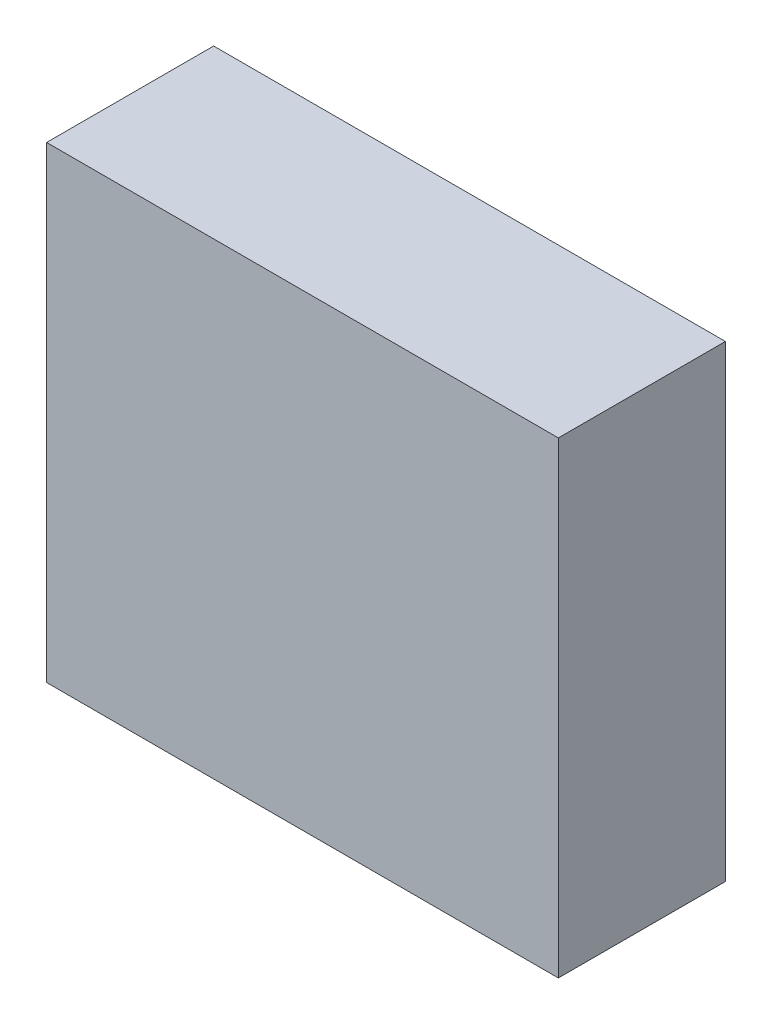
ISO-10303-21;
HEADER;
FILE_DESCRIPTION(('STEP AP214'),'2;1');
FILE_NAME('part.step','',(''),(''),'','','');
FILE_SCHEMA(('AUTOMOTIVE_DESIGN { 1 0 10303 214 1 1 1 1 }'));
ENDSEC;
DATA;
#1=APPLICATION_CONTEXT('core data for automotive mechanical design processes');
#2=APPLICATION_PROTOCOL_DEFINITION('international standard','automotive_design',2000,#1);
#3=PRODUCT_CONTEXT('',#1,'mechanical');
#4=PRODUCT('Part','Part','',(#3));
#5=PRODUCT_RELATED_PRODUCT_CATEGORY('part','',(#4));
#6=PRODUCT_DEFINITION_FORMATION('','',#4);
#7=PRODUCT_DEFINITION_CONTEXT('part definition',#1,'design');
#8=PRODUCT_DEFINITION('design','',#6,#7);
#9=PRODUCT_DEFINITION_SHAPE('','',#8);
#10=(LENGTH_UNIT() NAMED_UNIT(*) SI_UNIT(.MILLI.,.METRE.));
#11=(NAMED_UNIT(*) PLANE_ANGLE_UNIT() SI_UNIT($,.RADIAN.));
#12=(NAMED_UNIT(*) SI_UNIT($,.STERADIAN.) SOLID_ANGLE_UNIT());
#13=UNCERTAINTY_MEASURE_WITH_UNIT(LENGTH_MEASURE(1.E-05),#10,'distance_accuracy_value','');
#14=(GEOMETRIC_REPRESENTATION_CONTEXT(3) GLOBAL_UNCERTAINTY_ASSIGNED_CONTEXT((#13)) GLOBAL_UNIT_ASSIGNED_CONTEXT((#10,
#11,#12)) REPRESENTATION_CONTEXT('',''));
#15=CARTESIAN_POINT('',(0.,0.,0.));
#16=DIRECTION('',(0.,0.,1.));
#17=DIRECTION('',(1.,0.,0.));
#18=AXIS2_PLACEMENT_3D('',#15,#16,#17);
#19=CARTESIAN_POINT('',(-1.6,-1.4,1.));
#20=DIRECTION('',(1.,0.,0.));
#21=DIRECTION('',(0.,0.,-1.));
#22=AXIS2_PLACEMENT_3D('',#19,#20,#21);
#23=PLANE('',#22);
#24=DIRECTION('',(0.,-1.,0.));
#25=VECTOR('',#24,1.);
#26=CARTESIAN_POINT('',(-1.6,-1.4,0.));
#27=LINE('',#26,#25);
#28=CARTESIAN_POINT('',(-1.6,1.4,0.));
#29=VERTEX_POINT('',#28);
#30=CARTESIAN_POINT('',(-1.6,-1.4,0.));
#31=VERTEX_POINT('',#30);
#32=EDGE_CURVE('E96',#29,#31,#27,.T.);
#33=ORIENTED_EDGE('',*,*,#32,.T.);
#34=DIRECTION('',(0.,0.,-1.));
#35=VECTOR('',#34,1.);
#36=CARTESIAN_POINT('',(-1.6,-1.4,1.));
#37=LINE('',#36,#35);
#38=CARTESIAN_POINT('',(-1.6,-1.4,1.));
#39=VERTEX_POINT('',#38);
#40=EDGE_CURVE('E11',#39,#31,#37,.T.);
#41=ORIENTED_EDGE('',*,*,#40,.F.);
#42=DIRECTION('',(0.,-1.,0.));
#43=VECTOR('',#42,1.);
#44=CARTESIAN_POINT('',(-1.6,-1.4,1.));
#45=LINE('',#44,#43);
#46=CARTESIAN_POINT('',(-1.6,1.4,1.));
#47=VERTEX_POINT('',#46);
#48=EDGE_CURVE('E84',#47,#39,#45,.T.);
#49=ORIENTED_EDGE('',*,*,#48,.F.);
#50=DIRECTION('',(0.,0.,-1.));
#51=VECTOR('',#50,1.);
#52=CARTESIAN_POINT('',(-1.6,1.4,1.));
#53=LINE('',#52,#51);
#54=EDGE_CURVE('E92',#47,#29,#53,.T.);
#55=ORIENTED_EDGE('',*,*,#54,.T.);
#56=EDGE_LOOP('',(#33,#41,#49,#55));
#57=FACE_BOUND('',#56,.T.);
#58=ADVANCED_FACE('F33',(#57),#23,.F.);
#59=CARTESIAN_POINT('',(1.4635,-1.4,1.));
#60=DIRECTION('',(0.,1.,0.));
#61=DIRECTION('',(0.,0.,1.));
#62=AXIS2_PLACEMENT_3D('',#59,#60,#61);
#63=PLANE('',#62);
#64=DIRECTION('',(1.,0.,0.));
#65=VECTOR('',#64,1.);
#66=CARTESIAN_POINT('',(1.4635,-1.4,0.));
#67=LINE('',#66,#65);
#68=CARTESIAN_POINT('',(1.4635,-1.4,0.));
#69=VERTEX_POINT('',#68);
#70=EDGE_CURVE('E88',#31,#69,#67,.T.);
#71=ORIENTED_EDGE('',*,*,#70,.T.);
#72=DIRECTION('',(0.,0.,-1.));
#73=VECTOR('',#72,1.);
#74=CARTESIAN_POINT('',(1.4635,-1.4,1.));
#75=LINE('',#74,#73);
#76=CARTESIAN_POINT('',(1.4635,-1.4,1.));
#77=VERTEX_POINT('',#76);
#78=EDGE_CURVE('E41',#77,#69,#75,.T.);
#79=ORIENTED_EDGE('',*,*,#78,.F.);
#80=DIRECTION('',(1.,0.,0.));
#81=VECTOR('',#80,1.);
#82=CARTESIAN_POINT('',(1.4635,-1.4,1.));
#83=LINE('',#82,#81);
#84=EDGE_CURVE('E79',#39,#77,#83,.T.);
#85=ORIENTED_EDGE('',*,*,#84,.F.);
#86=ORIENTED_EDGE('',*,*,#40,.T.);
#87=EDGE_LOOP('',(#71,#79,#85,#86));
#88=FACE_BOUND('',#87,.T.);
#89=ADVANCED_FACE('F87',(#88),#63,.F.);
#90=CARTESIAN_POINT('',(1.4635,1.4,1.));
#91=DIRECTION('',(-1.,0.,0.));
#92=DIRECTION('',(0.,0.,1.));
#93=AXIS2_PLACEMENT_3D('',#90,#91,#92);
#94=PLANE('',#93);
#95=DIRECTION('',(0.,1.,0.));
#96=VECTOR('',#95,1.);
#97=CARTESIAN_POINT('',(1.4635,1.4,0.));
#98=LINE('',#97,#96);
#99=CARTESIAN_POINT('',(1.4635,1.4,0.));
#100=VERTEX_POINT('',#99);
#101=EDGE_CURVE('E66',#69,#100,#98,.T.);
#102=ORIENTED_EDGE('',*,*,#101,.T.);
#103=DIRECTION('',(0.,0.,-1.));
#104=VECTOR('',#103,1.);
#105=CARTESIAN_POINT('',(1.4635,1.4,1.));
#106=LINE('',#105,#104);
#107=CARTESIAN_POINT('',(1.4635,1.4,1.));
#108=VERTEX_POINT('',#107);
#109=EDGE_CURVE('E89',#108,#100,#106,.T.);
#110=ORIENTED_EDGE('',*,*,#109,.F.);
#111=DIRECTION('',(0.,1.,0.));
#112=VECTOR('',#111,1.);
#113=CARTESIAN_POINT('',(1.4635,1.4,1.));
#114=LINE('',#113,#112);
#115=EDGE_CURVE('E82',#77,#108,#114,.T.);
#116=ORIENTED_EDGE('',*,*,#115,.F.);
#117=ORIENTED_EDGE('',*,*,#78,.T.);
#118=EDGE_LOOP('',(#102,#110,#116,#117));
#119=FACE_BOUND('',#118,.T.);
#120=ADVANCED_FACE('F90',(#119),#94,.F.);
#121=CARTESIAN_POINT('',(-1.6,1.4,1.));
#122=DIRECTION('',(0.,-1.,0.));
#123=DIRECTION('',(0.,0.,-1.));
#124=AXIS2_PLACEMENT_3D('',#121,#122,#123);
#125=PLANE('',#124);
#126=DIRECTION('',(-1.,0.,0.));
#127=VECTOR('',#126,1.);
#128=CARTESIAN_POINT('',(-1.6,1.4,0.));
#129=LINE('',#128,#127);
#130=EDGE_CURVE('E72',#100,#29,#129,.T.);
#131=ORIENTED_EDGE('',*,*,#130,.T.);
#132=ORIENTED_EDGE('',*,*,#54,.F.);
#133=DIRECTION('',(-1.,0.,0.));
#134=VECTOR('',#133,1.);
#135=CARTESIAN_POINT('',(-1.6,1.4,1.));
#136=LINE('',#135,#134);
#137=EDGE_CURVE('E49',#108,#47,#136,.T.);
#138=ORIENTED_EDGE('',*,*,#137,.F.);
#139=ORIENTED_EDGE('',*,*,#109,.T.);
#140=EDGE_LOOP('',(#131,#132,#138,#139));
#141=FACE_BOUND('',#140,.T.);
#142=ADVANCED_FACE('F103',(#141),#125,.F.);
#143=CARTESIAN_POINT('',(0.,0.,1.));
#144=DIRECTION('',(0.,0.,-1.));
#145=DIRECTION('',(-1.,0.,0.));
#146=AXIS2_PLACEMENT_3D('',#143,#144,#145);
#147=PLANE('',#146);
#148=ORIENTED_EDGE('',*,*,#48,.T.);
#149=ORIENTED_EDGE('',*,*,#84,.T.);
#150=ORIENTED_EDGE('',*,*,#115,.T.);
#151=ORIENTED_EDGE('',*,*,#137,.T.);
#152=EDGE_LOOP('',(#148,#149,#150,#151));
#153=FACE_BOUND('',#152,.T.);
#154=ADVANCED_FACE('F80',(#153),#147,.F.);
#155=CARTESIAN_POINT('',(0.,0.,0.));
#156=DIRECTION('',(0.,0.,-1.));
#157=DIRECTION('',(-1.,0.,0.));
#158=AXIS2_PLACEMENT_3D('',#155,#156,#157);
#159=PLANE('',#158);
#160=ORIENTED_EDGE('',*,*,#32,.F.);
#161=ORIENTED_EDGE('',*,*,#130,.F.);
#162=ORIENTED_EDGE('',*,*,#101,.F.);
#163=ORIENTED_EDGE('',*,*,#70,.F.);
#164=EDGE_LOOP('',(#160,#161,#162,#163));
#165=FACE_BOUND('',#164,.T.);
#166=ADVANCED_FACE('F106',(#165),#159,.T.);
#167=CLOSED_SHELL('',(#58,#89,#120,#142,#154,#166));
#168=MANIFOLD_SOLID_BREP('B2',#167);
#169=ADVANCED_BREP_SHAPE_REPRESENTATION('',(#18,#168),#14);
#170=SHAPE_DEFINITION_REPRESENTATION(#9,#169);
ENDSEC;
END-ISO-10303-21;
